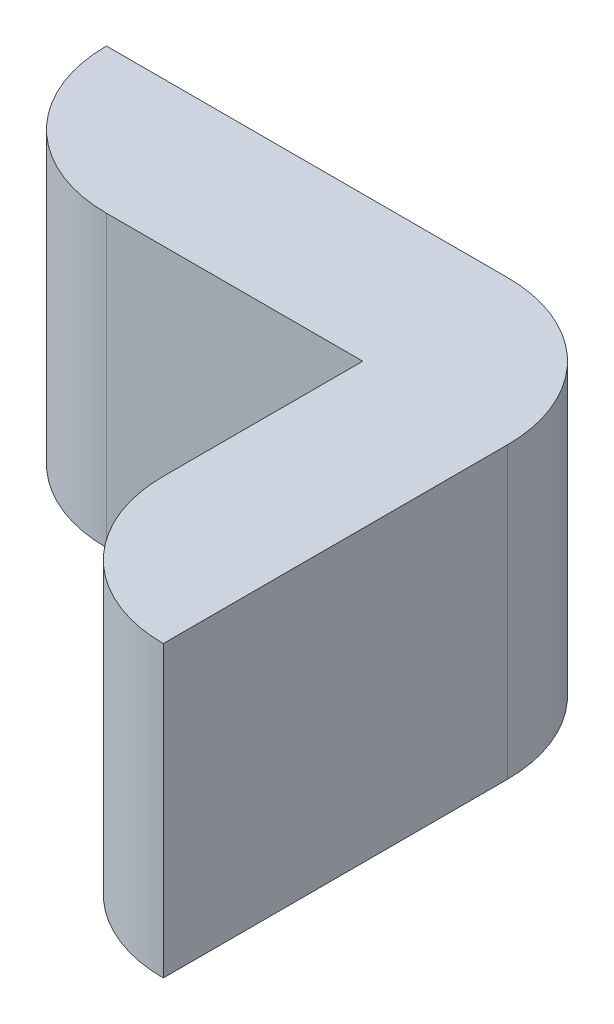
ISO-10303-21;
HEADER;
FILE_DESCRIPTION(('STEP AP214'),'2;1');
FILE_NAME('part.step','',(''),(''),'','','');
FILE_SCHEMA(('AUTOMOTIVE_DESIGN { 1 0 10303 214 1 1 1 1 }'));
ENDSEC;
DATA;
#1=APPLICATION_CONTEXT('core data for automotive mechanical design processes');
#2=APPLICATION_PROTOCOL_DEFINITION('international standard','automotive_design',2000,#1);
#3=PRODUCT_CONTEXT('',#1,'mechanical');
#4=PRODUCT('Part','Part','',(#3));
#5=PRODUCT_RELATED_PRODUCT_CATEGORY('part','',(#4));
#6=PRODUCT_DEFINITION_FORMATION('','',#4);
#7=PRODUCT_DEFINITION_CONTEXT('part definition',#1,'design');
#8=PRODUCT_DEFINITION('design','',#6,#7);
#9=PRODUCT_DEFINITION_SHAPE('','',#8);
#10=(LENGTH_UNIT() NAMED_UNIT(*) SI_UNIT(.MILLI.,.METRE.));
#11=(NAMED_UNIT(*) PLANE_ANGLE_UNIT() SI_UNIT($,.RADIAN.));
#12=(NAMED_UNIT(*) SI_UNIT($,.STERADIAN.) SOLID_ANGLE_UNIT());
#13=UNCERTAINTY_MEASURE_WITH_UNIT(LENGTH_MEASURE(1.E-05),#10,'distance_accuracy_value','');
#14=(GEOMETRIC_REPRESENTATION_CONTEXT(3) GLOBAL_UNCERTAINTY_ASSIGNED_CONTEXT((#13)) GLOBAL_UNIT_ASSIGNED_CONTEXT((#10,
#11,#12)) REPRESENTATION_CONTEXT('',''));
#15=CARTESIAN_POINT('',(0.,0.,0.));
#16=DIRECTION('',(0.,0.,1.));
#17=DIRECTION('',(1.,0.,0.));
#18=AXIS2_PLACEMENT_3D('',#15,#16,#17);
#19=CARTESIAN_POINT('',(3.95,-5.9294,0.7747));
#20=DIRECTION('',(-1.,0.,0.));
#21=DIRECTION('',(0.,0.,1.));
#22=AXIS2_PLACEMENT_3D('',#19,#20,#21);
#23=PLANE('',#22);
#24=DIRECTION('',(0.,0.,-1.));
#25=VECTOR('',#24,1.);
#26=CARTESIAN_POINT('',(3.95,-5.9294,0.));
#27=LINE('',#26,#25);
#28=CARTESIAN_POINT('',(3.95,-5.9294,0.2294));
#29=VERTEX_POINT('',#28);
#30=CARTESIAN_POINT('',(3.95,-5.9294,0.7747));
#31=VERTEX_POINT('',#30);
#32=EDGE_CURVE('E129',#29,#31,#27,.F.);
#33=ORIENTED_EDGE('',*,*,#32,.F.);
#34=DIRECTION('',(0.,-1.,0.));
#35=VECTOR('',#34,1.);
#36=CARTESIAN_POINT('',(3.95,-5.9294,0.2294));
#37=LINE('',#36,#35);
#38=CARTESIAN_POINT('',(3.95,-5.4706,0.2294));
#39=VERTEX_POINT('',#38);
#40=EDGE_CURVE('E82',#39,#29,#37,.T.);
#41=ORIENTED_EDGE('',*,*,#40,.F.);
#42=DIRECTION('',(0.,0.,-1.));
#43=VECTOR('',#42,1.);
#44=CARTESIAN_POINT('',(3.95,-5.4706,0.));
#45=LINE('',#44,#43);
#46=CARTESIAN_POINT('',(3.95,-5.4706,0.7747));
#47=VERTEX_POINT('',#46);
#48=EDGE_CURVE('E77',#39,#47,#45,.F.);
#49=ORIENTED_EDGE('',*,*,#48,.T.);
#50=DIRECTION('',(0.,-1.,0.));
#51=VECTOR('',#50,1.);
#52=CARTESIAN_POINT('',(3.95,-5.9294,0.7747));
#53=LINE('',#52,#51);
#54=EDGE_CURVE('E123',#31,#47,#53,.F.);
#55=ORIENTED_EDGE('',*,*,#54,.F.);
#56=EDGE_LOOP('',(#33,#41,#49,#55));
#57=FACE_BOUND('',#56,.T.);
#58=ADVANCED_FACE('F17',(#57),#23,.F.);
#59=CARTESIAN_POINT('',(3.95,-5.9294,0.5453));
#60=DIRECTION('',(0.,-1.,0.));
#61=DIRECTION('',(0.,0.,-1.));
#62=AXIS2_PLACEMENT_3D('',#59,#60,#61);
#63=CYLINDRICAL_SURFACE('',#62,0.2294);
#64=CARTESIAN_POINT('',(3.95,-5.4706,0.5453));
#65=DIRECTION('',(0.,-1.,0.));
#66=DIRECTION('',(0.,0.,-1.));
#67=AXIS2_PLACEMENT_3D('',#64,#65,#66);
#68=CIRCLE('',#67,0.2294);
#69=CARTESIAN_POINT('',(3.7206,-5.4706,0.5453));
#70=VERTEX_POINT('',#69);
#71=EDGE_CURVE('E107',#47,#70,#68,.T.);
#72=ORIENTED_EDGE('',*,*,#71,.T.);
#73=DIRECTION('',(0.,1.,0.));
#74=VECTOR('',#73,1.);
#75=CARTESIAN_POINT('',(3.7206,-5.9294,0.5453));
#76=LINE('',#75,#74);
#77=CARTESIAN_POINT('',(3.7206,-5.9294,0.5453));
#78=VERTEX_POINT('',#77);
#79=EDGE_CURVE('E118',#70,#78,#76,.F.);
#80=ORIENTED_EDGE('',*,*,#79,.T.);
#81=CARTESIAN_POINT('',(3.95,-5.9294,0.5453));
#82=DIRECTION('',(0.,-1.,0.));
#83=DIRECTION('',(0.,0.,-1.));
#84=AXIS2_PLACEMENT_3D('',#81,#82,#83);
#85=CIRCLE('',#84,0.2294);
#86=EDGE_CURVE('E126',#31,#78,#85,.T.);
#87=ORIENTED_EDGE('',*,*,#86,.F.);
#88=ORIENTED_EDGE('',*,*,#54,.T.);
#89=EDGE_LOOP('',(#72,#80,#87,#88));
#90=FACE_BOUND('',#89,.T.);
#91=ADVANCED_FACE('F133',(#90),#63,.T.);
#92=CARTESIAN_POINT('',(3.7206,-5.9294,0.2294));
#93=DIRECTION('',(1.,0.,0.));
#94=DIRECTION('',(0.,0.,-1.));
#95=AXIS2_PLACEMENT_3D('',#92,#93,#94);
#96=PLANE('',#95);
#97=ORIENTED_EDGE('',*,*,#79,.F.);
#98=DIRECTION('',(0.,0.,-1.));
#99=VECTOR('',#98,1.);
#100=CARTESIAN_POINT('',(3.7206,-5.4706,0.));
#101=LINE('',#100,#99);
#102=CARTESIAN_POINT('',(3.7206,-5.4706,0.2294));
#103=VERTEX_POINT('',#102);
#104=EDGE_CURVE('E102',#70,#103,#101,.T.);
#105=ORIENTED_EDGE('',*,*,#104,.T.);
#106=DIRECTION('',(0.,1.,0.));
#107=VECTOR('',#106,1.);
#108=CARTESIAN_POINT('',(3.7206,-5.9294,0.2294));
#109=LINE('',#108,#107);
#110=CARTESIAN_POINT('',(3.7206,-5.9294,0.2294));
#111=VERTEX_POINT('',#110);
#112=EDGE_CURVE('E115',#103,#111,#109,.F.);
#113=ORIENTED_EDGE('',*,*,#112,.T.);
#114=DIRECTION('',(0.,0.,-1.));
#115=VECTOR('',#114,1.);
#116=CARTESIAN_POINT('',(3.7206,-5.9294,0.));
#117=LINE('',#116,#115);
#118=EDGE_CURVE('E128',#78,#111,#117,.T.);
#119=ORIENTED_EDGE('',*,*,#118,.F.);
#120=EDGE_LOOP('',(#97,#105,#113,#119));
#121=FACE_BOUND('',#120,.T.);
#122=ADVANCED_FACE('F158',(#121),#96,.F.);
#123=CARTESIAN_POINT('',(3.3147,-5.9294,0.2294));
#124=DIRECTION('',(0.,0.,-1.));
#125=DIRECTION('',(-1.,0.,0.));
#126=AXIS2_PLACEMENT_3D('',#123,#124,#125);
#127=PLANE('',#126);
#128=ORIENTED_EDGE('',*,*,#112,.F.);
#129=DIRECTION('',(1.,0.,0.));
#130=VECTOR('',#129,1.);
#131=CARTESIAN_POINT('',(3.0853,-5.4706,0.2294));
#132=LINE('',#131,#130);
#133=CARTESIAN_POINT('',(3.3147,-5.4706,0.2294));
#134=VERTEX_POINT('',#133);
#135=EDGE_CURVE('E98',#103,#134,#132,.F.);
#136=ORIENTED_EDGE('',*,*,#135,.T.);
#137=DIRECTION('',(0.,-1.,0.));
#138=VECTOR('',#137,1.);
#139=CARTESIAN_POINT('',(3.3147,-5.9294,0.2294));
#140=LINE('',#139,#138);
#141=CARTESIAN_POINT('',(3.3147,-5.9294,0.2294));
#142=VERTEX_POINT('',#141);
#143=EDGE_CURVE('E101',#142,#134,#140,.F.);
#144=ORIENTED_EDGE('',*,*,#143,.F.);
#145=DIRECTION('',(1.,0.,0.));
#146=VECTOR('',#145,1.);
#147=CARTESIAN_POINT('',(3.0853,-5.9294,0.2294));
#148=LINE('',#147,#146);
#149=EDGE_CURVE('E94',#111,#142,#148,.F.);
#150=ORIENTED_EDGE('',*,*,#149,.F.);
#151=EDGE_LOOP('',(#128,#136,#144,#150));
#152=FACE_BOUND('',#151,.T.);
#153=ADVANCED_FACE('F156',(#152),#127,.F.);
#154=CARTESIAN_POINT('',(3.7206,-5.9294,0.2294));
#155=DIRECTION('',(0.,-1.,0.));
#156=DIRECTION('',(0.,0.,-1.));
#157=AXIS2_PLACEMENT_3D('',#154,#155,#156);
#158=CYLINDRICAL_SURFACE('',#157,0.2294);
#159=CARTESIAN_POINT('',(3.7206,-5.4706,0.2294));
#160=DIRECTION('',(0.,-1.,0.));
#161=DIRECTION('',(0.,0.,-1.));
#162=AXIS2_PLACEMENT_3D('',#159,#160,#161);
#163=CIRCLE('',#162,0.2294);
#164=CARTESIAN_POINT('',(3.7206,-5.4706,0.));
#165=VERTEX_POINT('',#164);
#166=EDGE_CURVE('E20',#165,#39,#163,.T.);
#167=ORIENTED_EDGE('',*,*,#166,.T.);
#168=ORIENTED_EDGE('',*,*,#40,.T.);
#169=CARTESIAN_POINT('',(3.7206,-5.9294,0.2294));
#170=DIRECTION('',(0.,-1.,0.));
#171=DIRECTION('',(0.,0.,-1.));
#172=AXIS2_PLACEMENT_3D('',#169,#170,#171);
#173=CIRCLE('',#172,0.2294);
#174=CARTESIAN_POINT('',(3.7206,-5.9294,0.));
#175=VERTEX_POINT('',#174);
#176=EDGE_CURVE('E92',#175,#29,#173,.T.);
#177=ORIENTED_EDGE('',*,*,#176,.F.);
#178=DIRECTION('',(0.,1.,0.));
#179=VECTOR('',#178,1.);
#180=CARTESIAN_POINT('',(3.7206,-5.9294,0.));
#181=LINE('',#180,#179);
#182=EDGE_CURVE('E86',#175,#165,#181,.T.);
#183=ORIENTED_EDGE('',*,*,#182,.T.);
#184=EDGE_LOOP('',(#167,#168,#177,#183));
#185=FACE_BOUND('',#184,.T.);
#186=ADVANCED_FACE('F90',(#185),#158,.T.);
#187=CARTESIAN_POINT('',(3.0853,-5.4706,0.));
#188=DIRECTION('',(0.,-1.,0.));
#189=DIRECTION('',(0.,0.,-1.));
#190=AXIS2_PLACEMENT_3D('',#187,#188,#189);
#191=PLANE('',#190);
#192=ORIENTED_EDGE('',*,*,#135,.F.);
#193=ORIENTED_EDGE('',*,*,#104,.F.);
#194=ORIENTED_EDGE('',*,*,#71,.F.);
#195=ORIENTED_EDGE('',*,*,#48,.F.);
#196=ORIENTED_EDGE('',*,*,#166,.F.);
#197=DIRECTION('',(1.,0.,0.));
#198=VECTOR('',#197,1.);
#199=CARTESIAN_POINT('',(3.7206,-5.4706,0.));
#200=LINE('',#199,#198);
#201=CARTESIAN_POINT('',(3.0853,-5.4706,0.));
#202=VERTEX_POINT('',#201);
#203=EDGE_CURVE('E74',#165,#202,#200,.F.);
#204=ORIENTED_EDGE('',*,*,#203,.T.);
#205=CARTESIAN_POINT('',(3.3147,-5.4706,0.));
#206=DIRECTION('',(0.,-1.,0.));
#207=DIRECTION('',(0.,0.,-1.));
#208=AXIS2_PLACEMENT_3D('',#205,#206,#207);
#209=CIRCLE('',#208,0.2294);
#210=EDGE_CURVE('E114',#134,#202,#209,.T.);
#211=ORIENTED_EDGE('',*,*,#210,.F.);
#212=EDGE_LOOP('',(#192,#193,#194,#195,#196,#204,#211));
#213=FACE_BOUND('',#212,.T.);
#214=ADVANCED_FACE('F72',(#213),#191,.F.);
#215=CARTESIAN_POINT('',(3.3147,-5.9294,0.));
#216=DIRECTION('',(0.,-1.,0.));
#217=DIRECTION('',(0.,0.,-1.));
#218=AXIS2_PLACEMENT_3D('',#215,#216,#217);
#219=CYLINDRICAL_SURFACE('',#218,0.2294);
#220=ORIENTED_EDGE('',*,*,#210,.T.);
#221=DIRECTION('',(0.,1.,0.));
#222=VECTOR('',#221,1.);
#223=CARTESIAN_POINT('',(3.0853,-5.9294,0.));
#224=LINE('',#223,#222);
#225=CARTESIAN_POINT('',(3.0853,-5.9294,0.));
#226=VERTEX_POINT('',#225);
#227=EDGE_CURVE('E26',#202,#226,#224,.F.);
#228=ORIENTED_EDGE('',*,*,#227,.T.);
#229=CARTESIAN_POINT('',(3.3147,-5.9294,0.));
#230=DIRECTION('',(0.,-1.,0.));
#231=DIRECTION('',(0.,0.,-1.));
#232=AXIS2_PLACEMENT_3D('',#229,#230,#231);
#233=CIRCLE('',#232,0.2294);
#234=EDGE_CURVE('E34',#142,#226,#233,.T.);
#235=ORIENTED_EDGE('',*,*,#234,.F.);
#236=ORIENTED_EDGE('',*,*,#143,.T.);
#237=EDGE_LOOP('',(#220,#228,#235,#236));
#238=FACE_BOUND('',#237,.T.);
#239=ADVANCED_FACE('F141',(#238),#219,.T.);
#240=CARTESIAN_POINT('',(3.0853,-5.9294,0.));
#241=DIRECTION('',(0.,-1.,0.));
#242=DIRECTION('',(0.,0.,-1.));
#243=AXIS2_PLACEMENT_3D('',#240,#241,#242);
#244=PLANE('',#243);
#245=ORIENTED_EDGE('',*,*,#149,.T.);
#246=ORIENTED_EDGE('',*,*,#234,.T.);
#247=DIRECTION('',(1.,0.,0.));
#248=VECTOR('',#247,1.);
#249=CARTESIAN_POINT('',(3.7206,-5.9294,0.));
#250=LINE('',#249,#248);
#251=EDGE_CURVE('E11',#226,#175,#250,.T.);
#252=ORIENTED_EDGE('',*,*,#251,.T.);
#253=ORIENTED_EDGE('',*,*,#176,.T.);
#254=ORIENTED_EDGE('',*,*,#32,.T.);
#255=ORIENTED_EDGE('',*,*,#86,.T.);
#256=ORIENTED_EDGE('',*,*,#118,.T.);
#257=EDGE_LOOP('',(#245,#246,#252,#253,#254,#255,#256));
#258=FACE_BOUND('',#257,.T.);
#259=ADVANCED_FACE('F139',(#258),#244,.T.);
#260=CARTESIAN_POINT('',(3.7206,-5.9294,0.));
#261=DIRECTION('',(0.,0.,1.));
#262=DIRECTION('',(1.,0.,0.));
#263=AXIS2_PLACEMENT_3D('',#260,#261,#262);
#264=PLANE('',#263);
#265=ORIENTED_EDGE('',*,*,#227,.F.);
#266=ORIENTED_EDGE('',*,*,#203,.F.);
#267=ORIENTED_EDGE('',*,*,#182,.F.);
#268=ORIENTED_EDGE('',*,*,#251,.F.);
#269=EDGE_LOOP('',(#265,#266,#267,#268));
#270=FACE_BOUND('',#269,.T.);
#271=ADVANCED_FACE('F85',(#270),#264,.F.);
#272=CLOSED_SHELL('',(#58,#91,#122,#153,#186,#214,#239,#259,#271));
#273=MANIFOLD_SOLID_BREP('B1',#272);
#274=ADVANCED_BREP_SHAPE_REPRESENTATION('',(#18,#273),#14);
#275=SHAPE_DEFINITION_REPRESENTATION(#9,#274);
ENDSEC;
END-ISO-10303-21;
